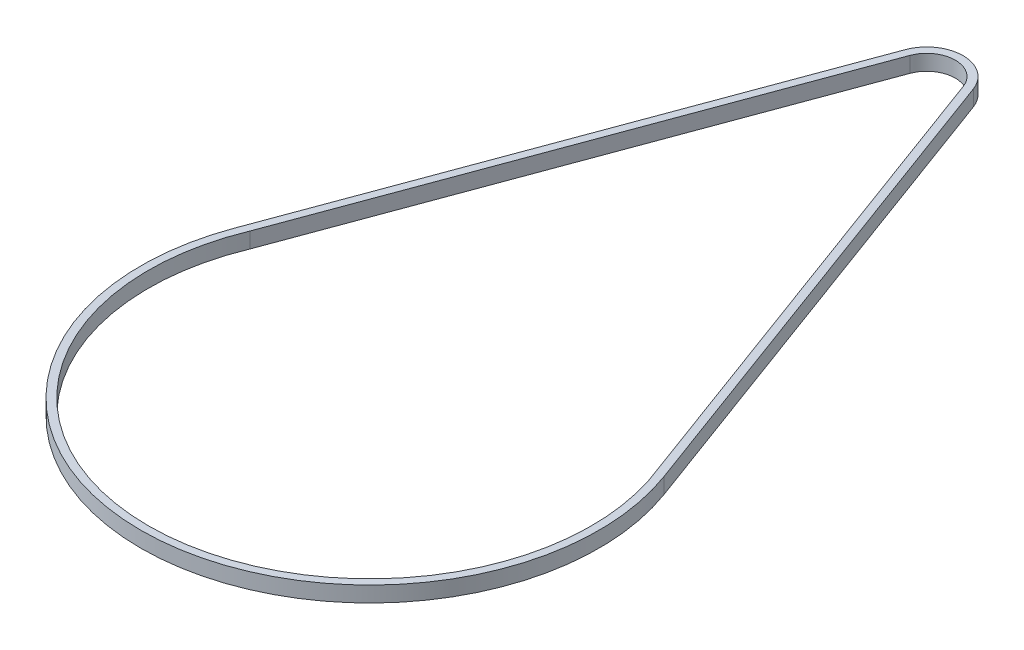
ISO-10303-21;
HEADER;
FILE_DESCRIPTION(('STEP AP214'),'2;1');
FILE_NAME('part.step','',(''),(''),'','','');
FILE_SCHEMA(('AUTOMOTIVE_DESIGN { 1 0 10303 214 1 1 1 1 }'));
ENDSEC;
DATA;
#1=APPLICATION_CONTEXT('core data for automotive mechanical design processes');
#2=APPLICATION_PROTOCOL_DEFINITION('international standard','automotive_design',2000,#1);
#3=PRODUCT_CONTEXT('',#1,'mechanical');
#4=PRODUCT('Part','Part','',(#3));
#5=PRODUCT_RELATED_PRODUCT_CATEGORY('part','',(#4));
#6=PRODUCT_DEFINITION_FORMATION('','',#4);
#7=PRODUCT_DEFINITION_CONTEXT('part definition',#1,'design');
#8=PRODUCT_DEFINITION('design','',#6,#7);
#9=PRODUCT_DEFINITION_SHAPE('','',#8);
#10=(LENGTH_UNIT() NAMED_UNIT(*) SI_UNIT(.MILLI.,.METRE.));
#11=(NAMED_UNIT(*) PLANE_ANGLE_UNIT() SI_UNIT($,.RADIAN.));
#12=(NAMED_UNIT(*) SI_UNIT($,.STERADIAN.) SOLID_ANGLE_UNIT());
#13=UNCERTAINTY_MEASURE_WITH_UNIT(LENGTH_MEASURE(1.E-05),#10,'distance_accuracy_value','');
#14=(GEOMETRIC_REPRESENTATION_CONTEXT(3) GLOBAL_UNCERTAINTY_ASSIGNED_CONTEXT((#13)) GLOBAL_UNIT_ASSIGNED_CONTEXT((#10,
#11,#12)) REPRESENTATION_CONTEXT('',''));
#15=CARTESIAN_POINT('',(0.,0.,0.));
#16=DIRECTION('',(0.,0.,1.));
#17=DIRECTION('',(1.,0.,0.));
#18=AXIS2_PLACEMENT_3D('',#15,#16,#17);
#19=CARTESIAN_POINT('',(0.,35.,0.));
#20=DIRECTION('',(0.,-1.,0.));
#21=DIRECTION('',(0.,0.,-1.));
#22=AXIS2_PLACEMENT_3D('',#19,#20,#21);
#23=CYLINDRICAL_SURFACE('',#22,71.05);
#24=CARTESIAN_POINT('',(0.,5.,0.));
#25=DIRECTION('',(0.,1.,0.));
#26=DIRECTION('',(0.,0.,1.));
#27=AXIS2_PLACEMENT_3D('',#24,#25,#26);
#28=CIRCLE('',#27,71.05);
#29=CARTESIAN_POINT('',(65.6376534405933,5.,-27.1992821745826));
#30=VERTEX_POINT('',#29);
#31=CARTESIAN_POINT('',(-65.6376534405931,5.,-27.1992821745832));
#32=VERTEX_POINT('',#31);
#33=EDGE_CURVE('E12',#30,#32,#28,.F.);
#34=ORIENTED_EDGE('',*,*,#33,.F.);
#35=DIRECTION('',(0.,-1.,0.));
#36=VECTOR('',#35,1.);
#37=CARTESIAN_POINT('',(65.6376534405933,35.,-27.1992821745826));
#38=LINE('',#37,#36);
#39=CARTESIAN_POINT('',(65.6376534405933,0.,-27.1992821745826));
#40=VERTEX_POINT('',#39);
#41=EDGE_CURVE('E77',#40,#30,#38,.F.);
#42=ORIENTED_EDGE('',*,*,#41,.F.);
#43=CARTESIAN_POINT('',(0.,0.,0.));
#44=DIRECTION('',(0.,-1.,0.));
#45=DIRECTION('',(0.,0.,-1.));
#46=AXIS2_PLACEMENT_3D('',#43,#44,#45);
#47=CIRCLE('',#46,71.05);
#48=CARTESIAN_POINT('',(-65.6376534405931,0.,-27.1992821745833));
#49=VERTEX_POINT('',#48);
#50=EDGE_CURVE('E154',#40,#49,#47,.T.);
#51=ORIENTED_EDGE('',*,*,#50,.T.);
#52=DIRECTION('',(0.,-1.,0.));
#53=VECTOR('',#52,1.);
#54=CARTESIAN_POINT('',(-65.6376534405929,35.,-27.1992821745836));
#55=LINE('',#54,#53);
#56=EDGE_CURVE('E162',#49,#32,#55,.F.);
#57=ORIENTED_EDGE('',*,*,#56,.T.);
#58=EDGE_LOOP('',(#34,#42,#51,#57));
#59=FACE_BOUND('',#58,.T.);
#60=ADVANCED_FACE('F67',(#59),#23,.F.);
#61=CARTESIAN_POINT('',(0.,0.,0.));
#62=DIRECTION('',(0.,-1.,0.));
#63=DIRECTION('',(0.,0.,-1.));
#64=AXIS2_PLACEMENT_3D('',#61,#62,#63);
#65=PLANE('',#64);
#66=ORIENTED_EDGE('',*,*,#50,.F.);
#67=DIRECTION('',(-0.346179680940386,0.,-0.938168230385154));
#68=VECTOR('',#67,1.);
#69=CARTESIAN_POINT('',(66.6052535161941,0.,-24.5770264483627));
#70=LINE('',#69,#68);
#71=CARTESIAN_POINT('',(8.58423930802416,0.,-181.817544080605));
#72=VERTEX_POINT('',#71);
#73=EDGE_CURVE('E176',#40,#72,#70,.T.);
#74=ORIENTED_EDGE('',*,*,#73,.T.);
#75=CARTESIAN_POINT('',(0.,0.,-178.65));
#76=DIRECTION('',(0.,-1.,0.));
#77=DIRECTION('',(0.,0.,-1.));
#78=AXIS2_PLACEMENT_3D('',#75,#76,#77);
#79=CIRCLE('',#78,9.15);
#80=CARTESIAN_POINT('',(-8.58423930802412,0.,-181.817544080605));
#81=VERTEX_POINT('',#80);
#82=EDGE_CURVE('E214',#81,#72,#79,.T.);
#83=ORIENTED_EDGE('',*,*,#82,.F.);
#84=DIRECTION('',(0.346179680940386,0.,-0.938168230385155));
#85=VECTOR('',#84,1.);
#86=CARTESIAN_POINT('',(-66.6052535161941,0.,-24.5770264483627));
#87=LINE('',#86,#85);
#88=EDGE_CURVE('E166',#49,#81,#87,.T.);
#89=ORIENTED_EDGE('',*,*,#88,.F.);
#90=EDGE_LOOP('',(#66,#74,#83,#89));
#91=FACE_BOUND('',#90,.T.);
#92=CARTESIAN_POINT('',(0.,0.,0.));
#93=DIRECTION('',(0.,-1.,0.));
#94=DIRECTION('',(0.,0.,-1.));
#95=AXIS2_PLACEMENT_3D('',#92,#93,#94);
#96=CIRCLE('',#95,73.5);
#97=CARTESIAN_POINT('',(68.9546058400758,0.,-25.4462636439966));
#98=VERTEX_POINT('',#97);
#99=CARTESIAN_POINT('',(-68.9546058400758,0.,-25.4462636439966));
#100=VERTEX_POINT('',#99);
#101=EDGE_CURVE('E180',#98,#100,#96,.T.);
#102=ORIENTED_EDGE('',*,*,#101,.T.);
#103=DIRECTION('',(0.346207668625805,0.,-0.938157902586065));
#104=VECTOR('',#103,1.);
#105=CARTESIAN_POINT('',(-68.9546058400758,0.,-25.4462636439966));
#106=LINE('',#105,#104);
#107=CARTESIAN_POINT('',(-10.9295395651277,0.,-182.683319339491));
#108=VERTEX_POINT('',#107);
#109=EDGE_CURVE('E117',#100,#108,#106,.T.);
#110=ORIENTED_EDGE('',*,*,#109,.T.);
#111=CARTESIAN_POINT('',(0.,0.,-178.65));
#112=DIRECTION('',(0.,-1.,0.));
#113=DIRECTION('',(0.,0.,-1.));
#114=AXIS2_PLACEMENT_3D('',#111,#112,#113);
#115=CIRCLE('',#114,11.65);
#116=CARTESIAN_POINT('',(10.9295395651277,0.,-182.683319339491));
#117=VERTEX_POINT('',#116);
#118=EDGE_CURVE('E185',#108,#117,#115,.T.);
#119=ORIENTED_EDGE('',*,*,#118,.T.);
#120=DIRECTION('',(-0.346207668625804,0.,-0.938157902586065));
#121=VECTOR('',#120,1.);
#122=CARTESIAN_POINT('',(68.9546058400758,0.,-25.4462636439966));
#123=LINE('',#122,#121);
#124=EDGE_CURVE('E188',#98,#117,#123,.T.);
#125=ORIENTED_EDGE('',*,*,#124,.F.);
#126=EDGE_LOOP('',(#102,#110,#119,#125));
#127=FACE_BOUND('',#126,.T.);
#128=ADVANCED_FACE('F235',(#91,#127),#65,.T.);
#129=CARTESIAN_POINT('',(-66.6052535161941,0.,-24.5770264483627));
#130=DIRECTION('',(0.938168230385155,0.,0.346179680940386));
#131=DIRECTION('',(0.346179680940386,0.,-0.938168230385155));
#132=AXIS2_PLACEMENT_3D('',#129,#130,#131);
#133=PLANE('',#132);
#134=ORIENTED_EDGE('',*,*,#56,.F.);
#135=ORIENTED_EDGE('',*,*,#88,.T.);
#136=DIRECTION('',(0.,1.,0.));
#137=VECTOR('',#136,1.);
#138=CARTESIAN_POINT('',(-8.58423930802417,0.,-181.817544080605));
#139=LINE('',#138,#137);
#140=CARTESIAN_POINT('',(-8.58423930802412,5.,-181.817544080605));
#141=VERTEX_POINT('',#140);
#142=EDGE_CURVE('E149',#81,#141,#139,.T.);
#143=ORIENTED_EDGE('',*,*,#142,.T.);
#144=DIRECTION('',(0.346179680940386,0.,-0.938168230385155));
#145=VECTOR('',#144,1.);
#146=CARTESIAN_POINT('',(-66.6052535161941,5.,-24.5770264483627));
#147=LINE('',#146,#145);
#148=EDGE_CURVE('E156',#32,#141,#147,.T.);
#149=ORIENTED_EDGE('',*,*,#148,.F.);
#150=EDGE_LOOP('',(#134,#135,#143,#149));
#151=FACE_BOUND('',#150,.T.);
#152=ADVANCED_FACE('F164',(#151),#133,.T.);
#153=CARTESIAN_POINT('',(66.6052535161941,0.,-24.5770264483627));
#154=DIRECTION('',(0.938168230385155,0.,-0.346179680940386));
#155=DIRECTION('',(-0.346179680940386,0.,-0.938168230385155));
#156=AXIS2_PLACEMENT_3D('',#153,#154,#155);
#157=PLANE('',#156);
#158=ORIENTED_EDGE('',*,*,#73,.F.);
#159=ORIENTED_EDGE('',*,*,#41,.T.);
#160=DIRECTION('',(-0.346179680940386,0.,-0.938168230385154));
#161=VECTOR('',#160,1.);
#162=CARTESIAN_POINT('',(66.6052535161941,5.,-24.5770264483627));
#163=LINE('',#162,#161);
#164=CARTESIAN_POINT('',(8.58423930802418,5.,-181.817544080605));
#165=VERTEX_POINT('',#164);
#166=EDGE_CURVE('E84',#30,#165,#163,.T.);
#167=ORIENTED_EDGE('',*,*,#166,.T.);
#168=DIRECTION('',(0.,1.,0.));
#169=VECTOR('',#168,1.);
#170=CARTESIAN_POINT('',(8.58423930802418,0.,-181.817544080605));
#171=LINE('',#170,#169);
#172=EDGE_CURVE('E152',#72,#165,#171,.T.);
#173=ORIENTED_EDGE('',*,*,#172,.F.);
#174=EDGE_LOOP('',(#158,#159,#167,#173));
#175=FACE_BOUND('',#174,.T.);
#176=ADVANCED_FACE('F230',(#175),#157,.F.);
#177=CARTESIAN_POINT('',(0.,5.,0.));
#178=DIRECTION('',(0.,-1.,0.));
#179=DIRECTION('',(0.,0.,-1.));
#180=AXIS2_PLACEMENT_3D('',#177,#178,#179);
#181=PLANE('',#180);
#182=ORIENTED_EDGE('',*,*,#148,.T.);
#183=CARTESIAN_POINT('',(0.,5.,-178.65));
#184=DIRECTION('',(0.,-1.,0.));
#185=DIRECTION('',(0.,0.,-1.));
#186=AXIS2_PLACEMENT_3D('',#183,#184,#185);
#187=CIRCLE('',#186,9.14999999999998);
#188=EDGE_CURVE('E145',#165,#141,#187,.F.);
#189=ORIENTED_EDGE('',*,*,#188,.F.);
#190=ORIENTED_EDGE('',*,*,#166,.F.);
#191=ORIENTED_EDGE('',*,*,#33,.T.);
#192=EDGE_LOOP('',(#182,#189,#190,#191));
#193=FACE_BOUND('',#192,.T.);
#194=DIRECTION('',(-0.346207668625804,0.,-0.938157902586065));
#195=VECTOR('',#194,1.);
#196=CARTESIAN_POINT('',(68.9546058400758,5.,-25.4462636439966));
#197=LINE('',#196,#195);
#198=CARTESIAN_POINT('',(68.9546058400758,5.,-25.4462636439966));
#199=VERTEX_POINT('',#198);
#200=CARTESIAN_POINT('',(10.9295395651277,5.,-182.683319339491));
#201=VERTEX_POINT('',#200);
#202=EDGE_CURVE('E109',#199,#201,#197,.T.);
#203=ORIENTED_EDGE('',*,*,#202,.T.);
#204=CARTESIAN_POINT('',(0.,5.,-178.65));
#205=DIRECTION('',(0.,-1.,0.));
#206=DIRECTION('',(0.,0.,-1.));
#207=AXIS2_PLACEMENT_3D('',#204,#205,#206);
#208=CIRCLE('',#207,11.65);
#209=CARTESIAN_POINT('',(-10.9295395651277,5.,-182.683319339491));
#210=VERTEX_POINT('',#209);
#211=EDGE_CURVE('E193',#210,#201,#208,.T.);
#212=ORIENTED_EDGE('',*,*,#211,.F.);
#213=DIRECTION('',(0.346207668625805,0.,-0.938157902586065));
#214=VECTOR('',#213,1.);
#215=CARTESIAN_POINT('',(-68.9546058400758,5.,-25.4462636439966));
#216=LINE('',#215,#214);
#217=CARTESIAN_POINT('',(-68.9546058400758,5.,-25.4462636439966));
#218=VERTEX_POINT('',#217);
#219=EDGE_CURVE('E174',#218,#210,#216,.T.);
#220=ORIENTED_EDGE('',*,*,#219,.F.);
#221=CARTESIAN_POINT('',(0.,5.,0.));
#222=DIRECTION('',(0.,-1.,0.));
#223=DIRECTION('',(0.,0.,-1.));
#224=AXIS2_PLACEMENT_3D('',#221,#222,#223);
#225=CIRCLE('',#224,73.5);
#226=EDGE_CURVE('E169',#199,#218,#225,.T.);
#227=ORIENTED_EDGE('',*,*,#226,.F.);
#228=EDGE_LOOP('',(#203,#212,#220,#227));
#229=FACE_BOUND('',#228,.T.);
#230=ADVANCED_FACE('F157',(#193,#229),#181,.F.);
#231=CARTESIAN_POINT('',(0.,0.,0.));
#232=DIRECTION('',(0.,1.,0.));
#233=DIRECTION('',(0.,0.,1.));
#234=AXIS2_PLACEMENT_3D('',#231,#232,#233);
#235=CYLINDRICAL_SURFACE('',#234,73.5);
#236=ORIENTED_EDGE('',*,*,#226,.T.);
#237=DIRECTION('',(0.,1.,0.));
#238=VECTOR('',#237,1.);
#239=CARTESIAN_POINT('',(-68.9546058400758,0.,-25.4462636439966));
#240=LINE('',#239,#238);
#241=EDGE_CURVE('E208',#100,#218,#240,.T.);
#242=ORIENTED_EDGE('',*,*,#241,.F.);
#243=ORIENTED_EDGE('',*,*,#101,.F.);
#244=DIRECTION('',(0.,1.,0.));
#245=VECTOR('',#244,1.);
#246=CARTESIAN_POINT('',(68.9546058400758,0.,-25.4462636439966));
#247=LINE('',#246,#245);
#248=EDGE_CURVE('E93',#98,#199,#247,.T.);
#249=ORIENTED_EDGE('',*,*,#248,.T.);
#250=EDGE_LOOP('',(#236,#242,#243,#249));
#251=FACE_BOUND('',#250,.T.);
#252=ADVANCED_FACE('F69',(#251),#235,.T.);
#253=CARTESIAN_POINT('',(-68.9546058400758,0.,-25.4462636439966));
#254=DIRECTION('',(0.938157902586065,0.,0.346207668625805));
#255=DIRECTION('',(0.346207668625805,0.,-0.938157902586065));
#256=AXIS2_PLACEMENT_3D('',#253,#254,#255);
#257=PLANE('',#256);
#258=ORIENTED_EDGE('',*,*,#219,.T.);
#259=DIRECTION('',(0.,1.,0.));
#260=VECTOR('',#259,1.);
#261=CARTESIAN_POINT('',(-10.9295395651277,0.,-182.683319339491));
#262=LINE('',#261,#260);
#263=EDGE_CURVE('E204',#108,#210,#262,.T.);
#264=ORIENTED_EDGE('',*,*,#263,.F.);
#265=ORIENTED_EDGE('',*,*,#109,.F.);
#266=ORIENTED_EDGE('',*,*,#241,.T.);
#267=EDGE_LOOP('',(#258,#264,#265,#266));
#268=FACE_BOUND('',#267,.T.);
#269=ADVANCED_FACE('F244',(#268),#257,.F.);
#270=CARTESIAN_POINT('',(0.,0.,-178.65));
#271=DIRECTION('',(0.,1.,0.));
#272=DIRECTION('',(0.,0.,1.));
#273=AXIS2_PLACEMENT_3D('',#270,#271,#272);
#274=CYLINDRICAL_SURFACE('',#273,11.65);
#275=ORIENTED_EDGE('',*,*,#211,.T.);
#276=DIRECTION('',(0.,1.,0.));
#277=VECTOR('',#276,1.);
#278=CARTESIAN_POINT('',(10.9295395651277,0.,-182.683319339491));
#279=LINE('',#278,#277);
#280=EDGE_CURVE('E201',#117,#201,#279,.T.);
#281=ORIENTED_EDGE('',*,*,#280,.F.);
#282=ORIENTED_EDGE('',*,*,#118,.F.);
#283=ORIENTED_EDGE('',*,*,#263,.T.);
#284=EDGE_LOOP('',(#275,#281,#282,#283));
#285=FACE_BOUND('',#284,.T.);
#286=ADVANCED_FACE('F247',(#285),#274,.T.);
#287=CARTESIAN_POINT('',(68.9546058400758,0.,-25.4462636439966));
#288=DIRECTION('',(0.938157902586065,0.,-0.346207668625804));
#289=DIRECTION('',(-0.346207668625804,0.,-0.938157902586065));
#290=AXIS2_PLACEMENT_3D('',#287,#288,#289);
#291=PLANE('',#290);
#292=ORIENTED_EDGE('',*,*,#202,.F.);
#293=ORIENTED_EDGE('',*,*,#248,.F.);
#294=ORIENTED_EDGE('',*,*,#124,.T.);
#295=ORIENTED_EDGE('',*,*,#280,.T.);
#296=EDGE_LOOP('',(#292,#293,#294,#295));
#297=FACE_BOUND('',#296,.T.);
#298=ADVANCED_FACE('F287',(#297),#291,.T.);
#299=CARTESIAN_POINT('',(0.,30.8801081914276,-178.65));
#300=DIRECTION('',(0.,-1.,0.));
#301=DIRECTION('',(0.,0.,-1.));
#302=AXIS2_PLACEMENT_3D('',#299,#300,#301);
#303=CYLINDRICAL_SURFACE('',#302,9.14999999999998);
#304=ORIENTED_EDGE('',*,*,#142,.F.);
#305=ORIENTED_EDGE('',*,*,#82,.T.);
#306=ORIENTED_EDGE('',*,*,#172,.T.);
#307=ORIENTED_EDGE('',*,*,#188,.T.);
#308=EDGE_LOOP('',(#304,#305,#306,#307));
#309=FACE_BOUND('',#308,.T.);
#310=ADVANCED_FACE('F147',(#309),#303,.F.);
#311=CLOSED_SHELL('',(#60,#128,#152,#176,#230,#252,#269,#286,#298,#310));
#312=MANIFOLD_SOLID_BREP('B2',#311);
#313=ADVANCED_BREP_SHAPE_REPRESENTATION('',(#18,#312),#14);
#314=SHAPE_DEFINITION_REPRESENTATION(#9,#313);
ENDSEC;
END-ISO-10303-21;
